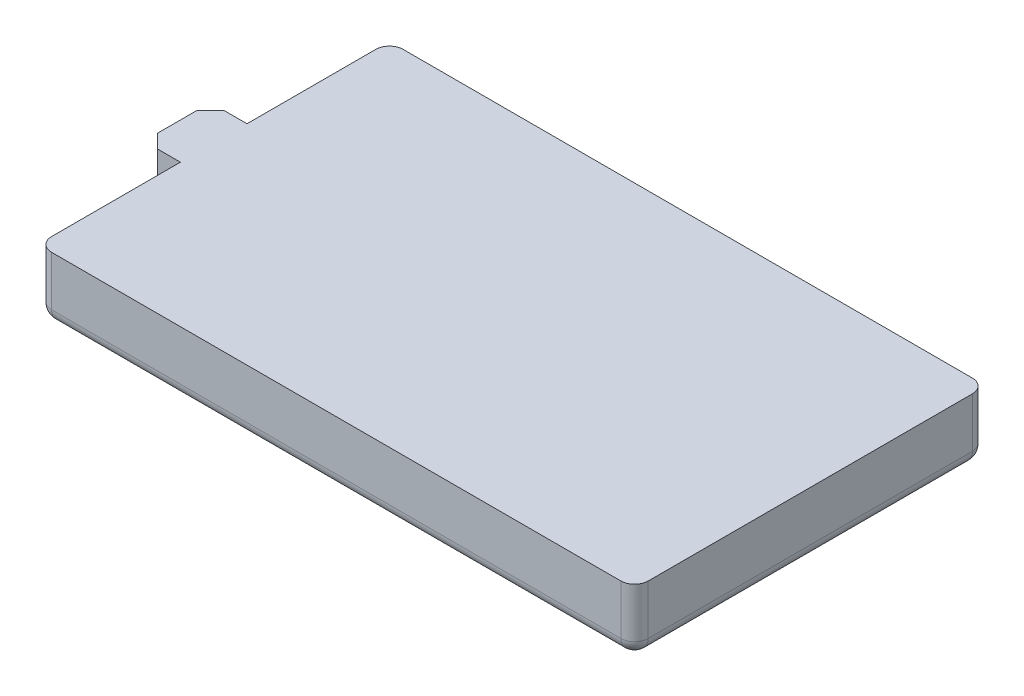
ISO-10303-21;
HEADER;
FILE_DESCRIPTION(('STEP AP214'),'2;1');
FILE_NAME('part.step','',(''),(''),'','','');
FILE_SCHEMA(('AUTOMOTIVE_DESIGN { 1 0 10303 214 1 1 1 1 }'));
ENDSEC;
DATA;
#1=APPLICATION_CONTEXT('core data for automotive mechanical design processes');
#2=APPLICATION_PROTOCOL_DEFINITION('international standard','automotive_design',2000,#1);
#3=PRODUCT_CONTEXT('',#1,'mechanical');
#4=PRODUCT('Part','Part','',(#3));
#5=PRODUCT_RELATED_PRODUCT_CATEGORY('part','',(#4));
#6=PRODUCT_DEFINITION_FORMATION('','',#4);
#7=PRODUCT_DEFINITION_CONTEXT('part definition',#1,'design');
#8=PRODUCT_DEFINITION('design','',#6,#7);
#9=PRODUCT_DEFINITION_SHAPE('','',#8);
#10=(LENGTH_UNIT() NAMED_UNIT(*) SI_UNIT(.MILLI.,.METRE.));
#11=(NAMED_UNIT(*) PLANE_ANGLE_UNIT() SI_UNIT($,.RADIAN.));
#12=(NAMED_UNIT(*) SI_UNIT($,.STERADIAN.) SOLID_ANGLE_UNIT());
#13=UNCERTAINTY_MEASURE_WITH_UNIT(LENGTH_MEASURE(1.E-05),#10,'distance_accuracy_value','');
#14=(GEOMETRIC_REPRESENTATION_CONTEXT(3) GLOBAL_UNCERTAINTY_ASSIGNED_CONTEXT((#13)) GLOBAL_UNIT_ASSIGNED_CONTEXT((#10,
#11,#12)) REPRESENTATION_CONTEXT('',''));
#15=CARTESIAN_POINT('',(0.,0.,0.));
#16=DIRECTION('',(0.,0.,1.));
#17=DIRECTION('',(1.,0.,0.));
#18=AXIS2_PLACEMENT_3D('',#15,#16,#17);
#19=CARTESIAN_POINT('',(55.3529500000001,11.7856,-32.6136));
#20=DIRECTION('',(-1.,0.,0.));
#21=DIRECTION('',(0.,0.,1.));
#22=AXIS2_PLACEMENT_3D('',#19,#20,#21);
#23=PLANE('',#22);
#24=DIRECTION('',(0.,0.,-1.));
#25=VECTOR('',#24,1.);
#26=CARTESIAN_POINT('',(55.3529500000001,2.54,-32.6136));
#27=LINE('',#26,#25);
#28=CARTESIAN_POINT('',(55.3529500000001,2.54,30.0736));
#29=VERTEX_POINT('',#28);
#30=CARTESIAN_POINT('',(55.3529500000001,2.54,-30.0736));
#31=VERTEX_POINT('',#30);
#32=EDGE_CURVE('E232',#29,#31,#27,.T.);
#33=ORIENTED_EDGE('',*,*,#32,.T.);
#34=DIRECTION('',(0.,-1.,0.));
#35=VECTOR('',#34,1.);
#36=CARTESIAN_POINT('',(55.3529500000001,11.7856,-30.0736));
#37=LINE('',#36,#35);
#38=CARTESIAN_POINT('',(55.3529500000001,11.7856,-30.0736));
#39=VERTEX_POINT('',#38);
#40=EDGE_CURVE('E234',#31,#39,#37,.F.);
#41=ORIENTED_EDGE('',*,*,#40,.T.);
#42=DIRECTION('',(0.,0.,-1.));
#43=VECTOR('',#42,1.);
#44=CARTESIAN_POINT('',(55.3529500000001,11.7856,-32.6136));
#45=LINE('',#44,#43);
#46=CARTESIAN_POINT('',(55.3529500000001,11.7856,30.0736));
#47=VERTEX_POINT('',#46);
#48=EDGE_CURVE('E197',#47,#39,#45,.T.);
#49=ORIENTED_EDGE('',*,*,#48,.F.);
#50=DIRECTION('',(0.,-1.,0.));
#51=VECTOR('',#50,1.);
#52=CARTESIAN_POINT('',(55.3529500000001,11.7856,30.0736));
#53=LINE('',#52,#51);
#54=EDGE_CURVE('E230',#47,#29,#53,.T.);
#55=ORIENTED_EDGE('',*,*,#54,.T.);
#56=EDGE_LOOP('',(#33,#41,#49,#55));
#57=FACE_BOUND('',#56,.T.);
#58=ADVANCED_FACE('F33',(#57),#23,.F.);
#59=CARTESIAN_POINT('',(-55.3529499999999,11.7856,-32.6136));
#60=DIRECTION('',(0.,0.,1.));
#61=DIRECTION('',(1.,0.,0.));
#62=AXIS2_PLACEMENT_3D('',#59,#60,#61);
#63=PLANE('',#62);
#64=DIRECTION('',(-1.,0.,0.));
#65=VECTOR('',#64,1.);
#66=CARTESIAN_POINT('',(-55.3529499999999,11.7856,-32.6136));
#67=LINE('',#66,#65);
#68=CARTESIAN_POINT('',(52.8129500000001,11.7856,-32.6136));
#69=VERTEX_POINT('',#68);
#70=CARTESIAN_POINT('',(-52.8129499999999,11.7856,-32.6136));
#71=VERTEX_POINT('',#70);
#72=EDGE_CURVE('E163',#69,#71,#67,.T.);
#73=ORIENTED_EDGE('',*,*,#72,.F.);
#74=DIRECTION('',(0.,-1.,0.));
#75=VECTOR('',#74,1.);
#76=CARTESIAN_POINT('',(52.8129500000001,11.7856,-32.6136));
#77=LINE('',#76,#75);
#78=CARTESIAN_POINT('',(52.8129500000001,2.54,-32.6136));
#79=VERTEX_POINT('',#78);
#80=EDGE_CURVE('E228',#69,#79,#77,.T.);
#81=ORIENTED_EDGE('',*,*,#80,.T.);
#82=DIRECTION('',(-1.,0.,0.));
#83=VECTOR('',#82,1.);
#84=CARTESIAN_POINT('',(-55.3529499999999,2.54,-32.6136));
#85=LINE('',#84,#83);
#86=CARTESIAN_POINT('',(-52.8129499999999,2.54,-32.6136));
#87=VERTEX_POINT('',#86);
#88=EDGE_CURVE('E226',#79,#87,#85,.T.);
#89=ORIENTED_EDGE('',*,*,#88,.T.);
#90=DIRECTION('',(0.,-1.,0.));
#91=VECTOR('',#90,1.);
#92=CARTESIAN_POINT('',(-52.8129499999999,11.7856,-32.6136));
#93=LINE('',#92,#91);
#94=EDGE_CURVE('E224',#87,#71,#93,.F.);
#95=ORIENTED_EDGE('',*,*,#94,.T.);
#96=EDGE_LOOP('',(#73,#81,#89,#95));
#97=FACE_BOUND('',#96,.T.);
#98=ADVANCED_FACE('F382',(#97),#63,.F.);
#99=CARTESIAN_POINT('',(-55.3529499999999,11.7856,-32.6136));
#100=DIRECTION('',(1.,0.,0.));
#101=DIRECTION('',(0.,0.,-1.));
#102=AXIS2_PLACEMENT_3D('',#99,#100,#101);
#103=PLANE('',#102);
#104=DIRECTION('',(0.,-1.,0.));
#105=VECTOR('',#104,1.);
#106=CARTESIAN_POINT('',(-55.3529499999999,11.7856,-30.0736));
#107=LINE('',#106,#105);
#108=CARTESIAN_POINT('',(-55.3529499999999,11.7856,-30.0736));
#109=VERTEX_POINT('',#108);
#110=CARTESIAN_POINT('',(-55.3529499999999,2.54,-30.0736));
#111=VERTEX_POINT('',#110);
#112=EDGE_CURVE('E215',#109,#111,#107,.T.);
#113=ORIENTED_EDGE('',*,*,#112,.T.);
#114=DIRECTION('',(0.,0.,1.));
#115=VECTOR('',#114,1.);
#116=CARTESIAN_POINT('',(-55.3529499999999,2.54,-32.6136));
#117=LINE('',#116,#115);
#118=CARTESIAN_POINT('',(-55.3529499999999,2.54,-6.17855));
#119=VERTEX_POINT('',#118);
#120=EDGE_CURVE('E169',#111,#119,#117,.T.);
#121=ORIENTED_EDGE('',*,*,#120,.T.);
#122=DIRECTION('',(0.,-1.,0.));
#123=VECTOR('',#122,1.);
#124=CARTESIAN_POINT('',(-55.3529499999999,11.7856,-6.17855));
#125=LINE('',#124,#123);
#126=CARTESIAN_POINT('',(-55.3529499999999,11.7856,-6.17855));
#127=VERTEX_POINT('',#126);
#128=EDGE_CURVE('E166',#127,#119,#125,.T.);
#129=ORIENTED_EDGE('',*,*,#128,.F.);
#130=DIRECTION('',(0.,0.,1.));
#131=VECTOR('',#130,1.);
#132=CARTESIAN_POINT('',(-55.3529499999999,11.7856,-32.6136));
#133=LINE('',#132,#131);
#134=EDGE_CURVE('E153',#109,#127,#133,.T.);
#135=ORIENTED_EDGE('',*,*,#134,.F.);
#136=EDGE_LOOP('',(#113,#121,#129,#135));
#137=FACE_BOUND('',#136,.T.);
#138=ADVANCED_FACE('F167',(#137),#103,.F.);
#139=CARTESIAN_POINT('',(-62.13475,11.7856,-6.17855));
#140=DIRECTION('',(0.,0.,1.));
#141=DIRECTION('',(1.,0.,0.));
#142=AXIS2_PLACEMENT_3D('',#139,#140,#141);
#143=PLANE('',#142);
#144=DIRECTION('',(-1.,0.,0.));
#145=VECTOR('',#144,1.);
#146=CARTESIAN_POINT('',(-62.13475,0.,-6.17855));
#147=LINE('',#146,#145);
#148=CARTESIAN_POINT('',(-52.8129499999999,0.,-6.17855));
#149=VERTEX_POINT('',#148);
#150=CARTESIAN_POINT('',(-59.59475,0.,-6.17855));
#151=VERTEX_POINT('',#150);
#152=EDGE_CURVE('E189',#149,#151,#147,.T.);
#153=ORIENTED_EDGE('',*,*,#152,.T.);
#154=DIRECTION('',(0.,1.,0.));
#155=VECTOR('',#154,1.);
#156=CARTESIAN_POINT('',(-59.59475,11.7856,-6.17855));
#157=LINE('',#156,#155);
#158=CARTESIAN_POINT('',(-59.59475,11.7856,-6.17855));
#159=VERTEX_POINT('',#158);
#160=EDGE_CURVE('E56',#151,#159,#157,.T.);
#161=ORIENTED_EDGE('',*,*,#160,.T.);
#162=DIRECTION('',(-1.,0.,0.));
#163=VECTOR('',#162,1.);
#164=CARTESIAN_POINT('',(-62.13475,11.7856,-6.17855));
#165=LINE('',#164,#163);
#166=EDGE_CURVE('E156',#127,#159,#165,.T.);
#167=ORIENTED_EDGE('',*,*,#166,.F.);
#168=ORIENTED_EDGE('',*,*,#128,.T.);
#169=CARTESIAN_POINT('',(-52.8129499999999,2.54,-6.17855));
#170=DIRECTION('',(0.,0.,1.));
#171=DIRECTION('',(1.,0.,0.));
#172=AXIS2_PLACEMENT_3D('',#169,#170,#171);
#173=CIRCLE('',#172,2.54);
#174=EDGE_CURVE('E245',#119,#149,#173,.T.);
#175=ORIENTED_EDGE('',*,*,#174,.T.);
#176=EDGE_LOOP('',(#153,#161,#167,#168,#175));
#177=FACE_BOUND('',#176,.T.);
#178=ADVANCED_FACE('F175',(#177),#143,.F.);
#179=CARTESIAN_POINT('',(-62.13475,11.7856,0.));
#180=DIRECTION('',(1.,0.,0.));
#181=DIRECTION('',(0.,0.,-1.));
#182=AXIS2_PLACEMENT_3D('',#179,#180,#181);
#183=PLANE('',#182);
#184=DIRECTION('',(0.,0.,1.));
#185=VECTOR('',#184,1.);
#186=CARTESIAN_POINT('',(-62.13475,11.7856,0.));
#187=LINE('',#186,#185);
#188=CARTESIAN_POINT('',(-62.13475,11.7856,-3.63854999999999));
#189=VERTEX_POINT('',#188);
#190=CARTESIAN_POINT('',(-62.13475,11.7856,3.63854999999999));
#191=VERTEX_POINT('',#190);
#192=EDGE_CURVE('E176',#189,#191,#187,.T.);
#193=ORIENTED_EDGE('',*,*,#192,.F.);
#194=DIRECTION('',(0.,-1.,0.));
#195=VECTOR('',#194,1.);
#196=CARTESIAN_POINT('',(-62.13475,11.7856,-3.63855));
#197=LINE('',#196,#195);
#198=CARTESIAN_POINT('',(-62.13475,0.,-3.63855));
#199=VERTEX_POINT('',#198);
#200=EDGE_CURVE('E283',#189,#199,#197,.T.);
#201=ORIENTED_EDGE('',*,*,#200,.T.);
#202=DIRECTION('',(0.,0.,1.));
#203=VECTOR('',#202,1.);
#204=CARTESIAN_POINT('',(-62.13475,0.,0.));
#205=LINE('',#204,#203);
#206=CARTESIAN_POINT('',(-62.13475,0.,3.63855));
#207=VERTEX_POINT('',#206);
#208=EDGE_CURVE('E191',#199,#207,#205,.T.);
#209=ORIENTED_EDGE('',*,*,#208,.T.);
#210=DIRECTION('',(0.,1.,0.));
#211=VECTOR('',#210,1.);
#212=CARTESIAN_POINT('',(-62.13475,11.7856,3.63855));
#213=LINE('',#212,#211);
#214=EDGE_CURVE('E247',#207,#191,#213,.T.);
#215=ORIENTED_EDGE('',*,*,#214,.T.);
#216=EDGE_LOOP('',(#193,#201,#209,#215));
#217=FACE_BOUND('',#216,.T.);
#218=ADVANCED_FACE('F295',(#217),#183,.F.);
#219=CARTESIAN_POINT('',(-62.13475,11.7856,6.17855));
#220=DIRECTION('',(0.,0.,-1.));
#221=DIRECTION('',(-1.,0.,0.));
#222=AXIS2_PLACEMENT_3D('',#219,#220,#221);
#223=PLANE('',#222);
#224=DIRECTION('',(1.,0.,0.));
#225=VECTOR('',#224,1.);
#226=CARTESIAN_POINT('',(-62.13475,11.7856,6.17855));
#227=LINE('',#226,#225);
#228=CARTESIAN_POINT('',(-59.59475,11.7856,6.17855));
#229=VERTEX_POINT('',#228);
#230=CARTESIAN_POINT('',(-55.3529499999999,11.7856,6.17855));
#231=VERTEX_POINT('',#230);
#232=EDGE_CURVE('E178',#229,#231,#227,.T.);
#233=ORIENTED_EDGE('',*,*,#232,.F.);
#234=DIRECTION('',(0.,-1.,0.));
#235=VECTOR('',#234,1.);
#236=CARTESIAN_POINT('',(-59.59475,11.7856,6.17855));
#237=LINE('',#236,#235);
#238=CARTESIAN_POINT('',(-59.59475,0.,6.17855));
#239=VERTEX_POINT('',#238);
#240=EDGE_CURVE('E11',#229,#239,#237,.T.);
#241=ORIENTED_EDGE('',*,*,#240,.T.);
#242=DIRECTION('',(1.,0.,0.));
#243=VECTOR('',#242,1.);
#244=CARTESIAN_POINT('',(-62.13475,0.,6.17855));
#245=LINE('',#244,#243);
#246=CARTESIAN_POINT('',(-52.8129499999999,0.,6.17855));
#247=VERTEX_POINT('',#246);
#248=EDGE_CURVE('E195',#239,#247,#245,.T.);
#249=ORIENTED_EDGE('',*,*,#248,.T.);
#250=CARTESIAN_POINT('',(-52.8129499999999,2.54,6.17855));
#251=DIRECTION('',(0.,0.,-1.));
#252=DIRECTION('',(-1.,0.,0.));
#253=AXIS2_PLACEMENT_3D('',#250,#251,#252);
#254=CIRCLE('',#253,2.54);
#255=CARTESIAN_POINT('',(-55.3529499999999,2.54,6.17855));
#256=VERTEX_POINT('',#255);
#257=EDGE_CURVE('E243',#247,#256,#254,.T.);
#258=ORIENTED_EDGE('',*,*,#257,.T.);
#259=DIRECTION('',(0.,-1.,0.));
#260=VECTOR('',#259,1.);
#261=CARTESIAN_POINT('',(-55.3529499999999,11.7856,6.17855));
#262=LINE('',#261,#260);
#263=EDGE_CURVE('E173',#231,#256,#262,.T.);
#264=ORIENTED_EDGE('',*,*,#263,.F.);
#265=EDGE_LOOP('',(#233,#241,#249,#258,#264));
#266=FACE_BOUND('',#265,.T.);
#267=ADVANCED_FACE('F338',(#266),#223,.F.);
#268=CARTESIAN_POINT('',(-55.3529499999999,11.7856,6.17855));
#269=DIRECTION('',(1.,0.,0.));
#270=DIRECTION('',(0.,0.,-1.));
#271=AXIS2_PLACEMENT_3D('',#268,#269,#270);
#272=PLANE('',#271);
#273=ORIENTED_EDGE('',*,*,#263,.T.);
#274=DIRECTION('',(0.,0.,1.));
#275=VECTOR('',#274,1.);
#276=CARTESIAN_POINT('',(-55.3529499999999,2.54,6.17855));
#277=LINE('',#276,#275);
#278=CARTESIAN_POINT('',(-55.3529499999999,2.54,30.0736));
#279=VERTEX_POINT('',#278);
#280=EDGE_CURVE('E201',#256,#279,#277,.T.);
#281=ORIENTED_EDGE('',*,*,#280,.T.);
#282=DIRECTION('',(0.,-1.,0.));
#283=VECTOR('',#282,1.);
#284=CARTESIAN_POINT('',(-55.3529499999999,11.7856,30.0736));
#285=LINE('',#284,#283);
#286=CARTESIAN_POINT('',(-55.3529499999999,11.7856,30.0736));
#287=VERTEX_POINT('',#286);
#288=EDGE_CURVE('E172',#279,#287,#285,.F.);
#289=ORIENTED_EDGE('',*,*,#288,.T.);
#290=DIRECTION('',(0.,0.,1.));
#291=VECTOR('',#290,1.);
#292=CARTESIAN_POINT('',(-55.3529499999999,11.7856,6.17855));
#293=LINE('',#292,#291);
#294=EDGE_CURVE('E183',#231,#287,#293,.T.);
#295=ORIENTED_EDGE('',*,*,#294,.F.);
#296=EDGE_LOOP('',(#273,#281,#289,#295));
#297=FACE_BOUND('',#296,.T.);
#298=ADVANCED_FACE('F341',(#297),#272,.F.);
#299=CARTESIAN_POINT('',(-55.3529499999999,11.7856,32.6136));
#300=DIRECTION('',(0.,0.,-1.));
#301=DIRECTION('',(-1.,0.,0.));
#302=AXIS2_PLACEMENT_3D('',#299,#300,#301);
#303=PLANE('',#302);
#304=DIRECTION('',(1.,0.,0.));
#305=VECTOR('',#304,1.);
#306=CARTESIAN_POINT('',(-55.3529499999999,11.7856,32.6136));
#307=LINE('',#306,#305);
#308=CARTESIAN_POINT('',(-52.8129499999999,11.7856,32.6136));
#309=VERTEX_POINT('',#308);
#310=CARTESIAN_POINT('',(52.81295,11.7856,32.6136));
#311=VERTEX_POINT('',#310);
#312=EDGE_CURVE('E186',#309,#311,#307,.T.);
#313=ORIENTED_EDGE('',*,*,#312,.F.);
#314=DIRECTION('',(0.,-1.,0.));
#315=VECTOR('',#314,1.);
#316=CARTESIAN_POINT('',(-52.8129499999999,11.7856,32.6136));
#317=LINE('',#316,#315);
#318=CARTESIAN_POINT('',(-52.8129499999999,2.54,32.6136));
#319=VERTEX_POINT('',#318);
#320=EDGE_CURVE('E222',#309,#319,#317,.T.);
#321=ORIENTED_EDGE('',*,*,#320,.T.);
#322=DIRECTION('',(1.,0.,0.));
#323=VECTOR('',#322,1.);
#324=CARTESIAN_POINT('',(-55.3529499999999,2.54,32.6136));
#325=LINE('',#324,#323);
#326=CARTESIAN_POINT('',(52.8129500000001,2.54,32.6136));
#327=VERTEX_POINT('',#326);
#328=EDGE_CURVE('E220',#319,#327,#325,.T.);
#329=ORIENTED_EDGE('',*,*,#328,.T.);
#330=DIRECTION('',(0.,-1.,0.));
#331=VECTOR('',#330,1.);
#332=CARTESIAN_POINT('',(52.8129500000001,11.7856,32.6136));
#333=LINE('',#332,#331);
#334=EDGE_CURVE('E218',#327,#311,#333,.F.);
#335=ORIENTED_EDGE('',*,*,#334,.T.);
#336=EDGE_LOOP('',(#313,#321,#329,#335));
#337=FACE_BOUND('',#336,.T.);
#338=ADVANCED_FACE('F350',(#337),#303,.F.);
#339=CARTESIAN_POINT('',(0.,11.7856,0.));
#340=DIRECTION('',(0.,1.,0.));
#341=DIRECTION('',(0.,0.,1.));
#342=AXIS2_PLACEMENT_3D('',#339,#340,#341);
#343=PLANE('',#342);
#344=ORIENTED_EDGE('',*,*,#166,.T.);
#345=DIRECTION('',(0.707106781186547,0.,-0.707106781186548));
#346=VECTOR('',#345,1.);
#347=CARTESIAN_POINT('',(-32.88665,11.7856,-32.88665));
#348=LINE('',#347,#346);
#349=EDGE_CURVE('E41',#159,#189,#348,.F.);
#350=ORIENTED_EDGE('',*,*,#349,.T.);
#351=ORIENTED_EDGE('',*,*,#192,.T.);
#352=DIRECTION('',(-0.707106781186547,0.,-0.707106781186548));
#353=VECTOR('',#352,1.);
#354=CARTESIAN_POINT('',(-32.88665,11.7856,32.88665));
#355=LINE('',#354,#353);
#356=EDGE_CURVE('E48',#191,#229,#355,.F.);
#357=ORIENTED_EDGE('',*,*,#356,.T.);
#358=ORIENTED_EDGE('',*,*,#232,.T.);
#359=ORIENTED_EDGE('',*,*,#294,.T.);
#360=CARTESIAN_POINT('',(-52.8129499999999,11.7856,30.0736));
#361=DIRECTION('',(0.,1.,0.));
#362=DIRECTION('',(0.,0.,1.));
#363=AXIS2_PLACEMENT_3D('',#360,#361,#362);
#364=CIRCLE('',#363,2.54);
#365=EDGE_CURVE('E238',#287,#309,#364,.T.);
#366=ORIENTED_EDGE('',*,*,#365,.T.);
#367=ORIENTED_EDGE('',*,*,#312,.T.);
#368=CARTESIAN_POINT('',(52.8129500000001,11.7856,30.0736));
#369=DIRECTION('',(0.,1.,0.));
#370=DIRECTION('',(0.,0.,1.));
#371=AXIS2_PLACEMENT_3D('',#368,#369,#370);
#372=CIRCLE('',#371,2.54);
#373=EDGE_CURVE('E236',#311,#47,#372,.T.);
#374=ORIENTED_EDGE('',*,*,#373,.T.);
#375=ORIENTED_EDGE('',*,*,#48,.T.);
#376=CARTESIAN_POINT('',(52.8129500000001,11.7856,-30.0736));
#377=DIRECTION('',(0.,1.,0.));
#378=DIRECTION('',(0.,0.,1.));
#379=AXIS2_PLACEMENT_3D('',#376,#377,#378);
#380=CIRCLE('',#379,2.54);
#381=EDGE_CURVE('E241',#39,#69,#380,.T.);
#382=ORIENTED_EDGE('',*,*,#381,.T.);
#383=ORIENTED_EDGE('',*,*,#72,.T.);
#384=CARTESIAN_POINT('',(-52.8129499999999,11.7856,-30.0736));
#385=DIRECTION('',(0.,1.,0.));
#386=DIRECTION('',(0.,0.,1.));
#387=AXIS2_PLACEMENT_3D('',#384,#385,#386);
#388=CIRCLE('',#387,2.54);
#389=EDGE_CURVE('E160',#71,#109,#388,.T.);
#390=ORIENTED_EDGE('',*,*,#389,.T.);
#391=ORIENTED_EDGE('',*,*,#134,.T.);
#392=EDGE_LOOP('',(#344,#350,#351,#357,#358,#359,#366,#367,#374,#375,#382,#383,#390,#391));
#393=FACE_BOUND('',#392,.T.);
#394=ADVANCED_FACE('F155',(#393),#343,.T.);
#395=CARTESIAN_POINT('',(0.,0.,0.));
#396=DIRECTION('',(0.,1.,0.));
#397=DIRECTION('',(0.,0.,1.));
#398=AXIS2_PLACEMENT_3D('',#395,#396,#397);
#399=PLANE('',#398);
#400=ORIENTED_EDGE('',*,*,#208,.F.);
#401=DIRECTION('',(-0.707106781186547,0.,0.707106781186548));
#402=VECTOR('',#401,1.);
#403=CARTESIAN_POINT('',(-62.13475,0.,-3.63855));
#404=LINE('',#403,#402);
#405=EDGE_CURVE('E288',#199,#151,#404,.F.);
#406=ORIENTED_EDGE('',*,*,#405,.T.);
#407=ORIENTED_EDGE('',*,*,#152,.F.);
#408=DIRECTION('',(0.,0.,1.));
#409=VECTOR('',#408,1.);
#410=CARTESIAN_POINT('',(-52.8129499999999,0.,0.));
#411=LINE('',#410,#409);
#412=CARTESIAN_POINT('',(-52.8129499999999,0.,-30.0736));
#413=VERTEX_POINT('',#412);
#414=EDGE_CURVE('E210',#149,#413,#411,.F.);
#415=ORIENTED_EDGE('',*,*,#414,.T.);
#416=DIRECTION('',(-1.,0.,0.));
#417=VECTOR('',#416,1.);
#418=CARTESIAN_POINT('',(0.,0.,-30.0736));
#419=LINE('',#418,#417);
#420=CARTESIAN_POINT('',(52.8129500000001,0.,-30.0736));
#421=VERTEX_POINT('',#420);
#422=EDGE_CURVE('E206',#413,#421,#419,.F.);
#423=ORIENTED_EDGE('',*,*,#422,.T.);
#424=DIRECTION('',(0.,0.,-1.));
#425=VECTOR('',#424,1.);
#426=CARTESIAN_POINT('',(52.8129500000001,0.,0.));
#427=LINE('',#426,#425);
#428=CARTESIAN_POINT('',(52.8129500000001,0.,30.0736));
#429=VERTEX_POINT('',#428);
#430=EDGE_CURVE('E204',#421,#429,#427,.F.);
#431=ORIENTED_EDGE('',*,*,#430,.T.);
#432=DIRECTION('',(1.,0.,0.));
#433=VECTOR('',#432,1.);
#434=CARTESIAN_POINT('',(0.,0.,30.0736));
#435=LINE('',#434,#433);
#436=CARTESIAN_POINT('',(-52.8129499999999,0.,30.0736));
#437=VERTEX_POINT('',#436);
#438=EDGE_CURVE('E208',#429,#437,#435,.F.);
#439=ORIENTED_EDGE('',*,*,#438,.T.);
#440=DIRECTION('',(0.,0.,1.));
#441=VECTOR('',#440,1.);
#442=CARTESIAN_POINT('',(-52.8129499999999,0.,0.));
#443=LINE('',#442,#441);
#444=EDGE_CURVE('E212',#437,#247,#443,.F.);
#445=ORIENTED_EDGE('',*,*,#444,.T.);
#446=ORIENTED_EDGE('',*,*,#248,.F.);
#447=DIRECTION('',(0.707106781186547,0.,0.707106781186548));
#448=VECTOR('',#447,1.);
#449=CARTESIAN_POINT('',(-59.59475,0.,6.17855));
#450=LINE('',#449,#448);
#451=EDGE_CURVE('E286',#239,#207,#450,.F.);
#452=ORIENTED_EDGE('',*,*,#451,.T.);
#453=EDGE_LOOP('',(#400,#406,#407,#415,#423,#431,#439,#445,#446,#452));
#454=FACE_BOUND('',#453,.T.);
#455=ADVANCED_FACE('F300',(#454),#399,.F.);
#456=CARTESIAN_POINT('',(-52.8129499999999,11.7856,-30.0736));
#457=DIRECTION('',(0.,-1.,0.));
#458=DIRECTION('',(0.,0.,-1.));
#459=AXIS2_PLACEMENT_3D('',#456,#457,#458);
#460=CYLINDRICAL_SURFACE('',#459,2.54);
#461=ORIENTED_EDGE('',*,*,#389,.F.);
#462=ORIENTED_EDGE('',*,*,#94,.F.);
#463=CARTESIAN_POINT('',(-52.8129499999999,2.54,-30.0736));
#464=DIRECTION('',(0.,-1.,0.));
#465=DIRECTION('',(0.,0.,-1.));
#466=AXIS2_PLACEMENT_3D('',#463,#464,#465);
#467=CIRCLE('',#466,2.54);
#468=EDGE_CURVE('E192',#111,#87,#467,.T.);
#469=ORIENTED_EDGE('',*,*,#468,.F.);
#470=ORIENTED_EDGE('',*,*,#112,.F.);
#471=EDGE_LOOP('',(#461,#462,#469,#470));
#472=FACE_BOUND('',#471,.T.);
#473=ADVANCED_FACE('F367',(#472),#460,.T.);
#474=CARTESIAN_POINT('',(-52.8129499999999,2.54,-32.6136));
#475=DIRECTION('',(0.,0.,1.));
#476=DIRECTION('',(1.,0.,0.));
#477=AXIS2_PLACEMENT_3D('',#474,#475,#476);
#478=CYLINDRICAL_SURFACE('',#477,2.54);
#479=ORIENTED_EDGE('',*,*,#174,.F.);
#480=ORIENTED_EDGE('',*,*,#120,.F.);
#481=CARTESIAN_POINT('',(-52.8129499999999,2.54,-30.0736));
#482=DIRECTION('',(0.,0.,-1.));
#483=DIRECTION('',(-1.,0.,0.));
#484=AXIS2_PLACEMENT_3D('',#481,#482,#483);
#485=CIRCLE('',#484,2.54);
#486=EDGE_CURVE('E277',#413,#111,#485,.T.);
#487=ORIENTED_EDGE('',*,*,#486,.F.);
#488=ORIENTED_EDGE('',*,*,#414,.F.);
#489=EDGE_LOOP('',(#479,#480,#487,#488));
#490=FACE_BOUND('',#489,.T.);
#491=ADVANCED_FACE('F304',(#490),#478,.T.);
#492=CARTESIAN_POINT('',(-52.8129499999999,2.54,-30.0736));
#493=DIRECTION('',(0.,0.,1.));
#494=DIRECTION('',(1.,0.,0.));
#495=AXIS2_PLACEMENT_3D('',#492,#493,#494);
#496=SPHERICAL_SURFACE('',#495,2.54);
#497=ORIENTED_EDGE('',*,*,#486,.T.);
#498=ORIENTED_EDGE('',*,*,#468,.T.);
#499=CARTESIAN_POINT('',(-52.8129499999999,2.54,-30.0736));
#500=DIRECTION('',(-1.,0.,0.));
#501=DIRECTION('',(0.,0.,1.));
#502=AXIS2_PLACEMENT_3D('',#499,#500,#501);
#503=CIRCLE('',#502,2.54);
#504=EDGE_CURVE('E274',#413,#87,#503,.F.);
#505=ORIENTED_EDGE('',*,*,#504,.F.);
#506=EDGE_LOOP('',(#497,#498,#505));
#507=FACE_BOUND('',#506,.T.);
#508=ADVANCED_FACE('F370',(#507),#496,.T.);
#509=CARTESIAN_POINT('',(52.8129500000001,11.7856,-30.0736));
#510=DIRECTION('',(0.,-1.,0.));
#511=DIRECTION('',(0.,0.,-1.));
#512=AXIS2_PLACEMENT_3D('',#509,#510,#511);
#513=CYLINDRICAL_SURFACE('',#512,2.54);
#514=ORIENTED_EDGE('',*,*,#381,.F.);
#515=ORIENTED_EDGE('',*,*,#40,.F.);
#516=CARTESIAN_POINT('',(52.8129500000001,2.54,-30.0736));
#517=DIRECTION('',(0.,-1.,0.));
#518=DIRECTION('',(0.,0.,-1.));
#519=AXIS2_PLACEMENT_3D('',#516,#517,#518);
#520=CIRCLE('',#519,2.54);
#521=EDGE_CURVE('E271',#79,#31,#520,.T.);
#522=ORIENTED_EDGE('',*,*,#521,.F.);
#523=ORIENTED_EDGE('',*,*,#80,.F.);
#524=EDGE_LOOP('',(#514,#515,#522,#523));
#525=FACE_BOUND('',#524,.T.);
#526=ADVANCED_FACE('F372',(#525),#513,.T.);
#527=CARTESIAN_POINT('',(-55.3529499999999,2.54,-30.0736));
#528=DIRECTION('',(-1.,0.,0.));
#529=DIRECTION('',(0.,0.,1.));
#530=AXIS2_PLACEMENT_3D('',#527,#528,#529);
#531=CYLINDRICAL_SURFACE('',#530,2.54);
#532=ORIENTED_EDGE('',*,*,#504,.T.);
#533=ORIENTED_EDGE('',*,*,#88,.F.);
#534=CARTESIAN_POINT('',(52.8129500000001,2.54,-30.0736));
#535=DIRECTION('',(1.,0.,0.));
#536=DIRECTION('',(0.,0.,-1.));
#537=AXIS2_PLACEMENT_3D('',#534,#535,#536);
#538=CIRCLE('',#537,2.54);
#539=EDGE_CURVE('E268',#421,#79,#538,.T.);
#540=ORIENTED_EDGE('',*,*,#539,.F.);
#541=ORIENTED_EDGE('',*,*,#422,.F.);
#542=EDGE_LOOP('',(#532,#533,#540,#541));
#543=FACE_BOUND('',#542,.T.);
#544=ADVANCED_FACE('F313',(#543),#531,.T.);
#545=CARTESIAN_POINT('',(52.8129500000001,2.54,-30.0736));
#546=DIRECTION('',(0.,0.,1.));
#547=DIRECTION('',(1.,0.,0.));
#548=AXIS2_PLACEMENT_3D('',#545,#546,#547);
#549=SPHERICAL_SURFACE('',#548,2.54);
#550=ORIENTED_EDGE('',*,*,#539,.T.);
#551=ORIENTED_EDGE('',*,*,#521,.T.);
#552=CARTESIAN_POINT('',(52.8129500000001,2.54,-30.0736));
#553=DIRECTION('',(0.,0.,-1.));
#554=DIRECTION('',(-1.,0.,0.));
#555=AXIS2_PLACEMENT_3D('',#552,#553,#554);
#556=CIRCLE('',#555,2.54);
#557=EDGE_CURVE('E265',#421,#31,#556,.F.);
#558=ORIENTED_EDGE('',*,*,#557,.F.);
#559=EDGE_LOOP('',(#550,#551,#558));
#560=FACE_BOUND('',#559,.T.);
#561=ADVANCED_FACE('F316',(#560),#549,.T.);
#562=CARTESIAN_POINT('',(52.8129500000001,11.7856,30.0736));
#563=DIRECTION('',(0.,-1.,0.));
#564=DIRECTION('',(0.,0.,-1.));
#565=AXIS2_PLACEMENT_3D('',#562,#563,#564);
#566=CYLINDRICAL_SURFACE('',#565,2.54);
#567=ORIENTED_EDGE('',*,*,#373,.F.);
#568=ORIENTED_EDGE('',*,*,#334,.F.);
#569=CARTESIAN_POINT('',(52.8129500000001,2.54,30.0736));
#570=DIRECTION('',(0.,-1.,0.));
#571=DIRECTION('',(0.,0.,-1.));
#572=AXIS2_PLACEMENT_3D('',#569,#570,#571);
#573=CIRCLE('',#572,2.54);
#574=EDGE_CURVE('E262',#29,#327,#573,.T.);
#575=ORIENTED_EDGE('',*,*,#574,.F.);
#576=ORIENTED_EDGE('',*,*,#54,.F.);
#577=EDGE_LOOP('',(#567,#568,#575,#576));
#578=FACE_BOUND('',#577,.T.);
#579=ADVANCED_FACE('F357',(#578),#566,.T.);
#580=CARTESIAN_POINT('',(52.8129500000001,2.54,-32.6136));
#581=DIRECTION('',(0.,0.,-1.));
#582=DIRECTION('',(-1.,0.,0.));
#583=AXIS2_PLACEMENT_3D('',#580,#581,#582);
#584=CYLINDRICAL_SURFACE('',#583,2.54);
#585=ORIENTED_EDGE('',*,*,#557,.T.);
#586=ORIENTED_EDGE('',*,*,#32,.F.);
#587=CARTESIAN_POINT('',(52.8129500000001,2.54,30.0736));
#588=DIRECTION('',(0.,0.,1.));
#589=DIRECTION('',(1.,0.,0.));
#590=AXIS2_PLACEMENT_3D('',#587,#588,#589);
#591=CIRCLE('',#590,2.54);
#592=EDGE_CURVE('E259',#429,#29,#591,.T.);
#593=ORIENTED_EDGE('',*,*,#592,.F.);
#594=ORIENTED_EDGE('',*,*,#430,.F.);
#595=EDGE_LOOP('',(#585,#586,#593,#594));
#596=FACE_BOUND('',#595,.T.);
#597=ADVANCED_FACE('F319',(#596),#584,.T.);
#598=CARTESIAN_POINT('',(52.8129500000001,2.54,30.0736));
#599=DIRECTION('',(0.,0.,1.));
#600=DIRECTION('',(1.,0.,0.));
#601=AXIS2_PLACEMENT_3D('',#598,#599,#600);
#602=SPHERICAL_SURFACE('',#601,2.54);
#603=ORIENTED_EDGE('',*,*,#592,.T.);
#604=ORIENTED_EDGE('',*,*,#574,.T.);
#605=CARTESIAN_POINT('',(52.8129500000001,2.54,30.0736));
#606=DIRECTION('',(1.,0.,0.));
#607=DIRECTION('',(0.,0.,-1.));
#608=AXIS2_PLACEMENT_3D('',#605,#606,#607);
#609=CIRCLE('',#608,2.54);
#610=EDGE_CURVE('E256',#429,#327,#609,.F.);
#611=ORIENTED_EDGE('',*,*,#610,.F.);
#612=EDGE_LOOP('',(#603,#604,#611));
#613=FACE_BOUND('',#612,.T.);
#614=ADVANCED_FACE('F324',(#613),#602,.T.);
#615=CARTESIAN_POINT('',(-52.8129499999999,11.7856,30.0736));
#616=DIRECTION('',(0.,-1.,0.));
#617=DIRECTION('',(0.,0.,-1.));
#618=AXIS2_PLACEMENT_3D('',#615,#616,#617);
#619=CYLINDRICAL_SURFACE('',#618,2.54);
#620=ORIENTED_EDGE('',*,*,#365,.F.);
#621=ORIENTED_EDGE('',*,*,#288,.F.);
#622=CARTESIAN_POINT('',(-52.8129499999999,2.54,30.0736));
#623=DIRECTION('',(0.,-1.,0.));
#624=DIRECTION('',(0.,0.,-1.));
#625=AXIS2_PLACEMENT_3D('',#622,#623,#624);
#626=CIRCLE('',#625,2.54);
#627=EDGE_CURVE('E253',#319,#279,#626,.T.);
#628=ORIENTED_EDGE('',*,*,#627,.F.);
#629=ORIENTED_EDGE('',*,*,#320,.F.);
#630=EDGE_LOOP('',(#620,#621,#628,#629));
#631=FACE_BOUND('',#630,.T.);
#632=ADVANCED_FACE('F347',(#631),#619,.T.);
#633=CARTESIAN_POINT('',(-55.3529499999999,2.54,30.0736));
#634=DIRECTION('',(1.,0.,0.));
#635=DIRECTION('',(0.,0.,-1.));
#636=AXIS2_PLACEMENT_3D('',#633,#634,#635);
#637=CYLINDRICAL_SURFACE('',#636,2.54);
#638=ORIENTED_EDGE('',*,*,#610,.T.);
#639=ORIENTED_EDGE('',*,*,#328,.F.);
#640=CARTESIAN_POINT('',(-52.8129499999999,2.54,30.0736));
#641=DIRECTION('',(-1.,0.,0.));
#642=DIRECTION('',(0.,0.,1.));
#643=AXIS2_PLACEMENT_3D('',#640,#641,#642);
#644=CIRCLE('',#643,2.54);
#645=EDGE_CURVE('E250',#437,#319,#644,.T.);
#646=ORIENTED_EDGE('',*,*,#645,.F.);
#647=ORIENTED_EDGE('',*,*,#438,.F.);
#648=EDGE_LOOP('',(#638,#639,#646,#647));
#649=FACE_BOUND('',#648,.T.);
#650=ADVANCED_FACE('F328',(#649),#637,.T.);
#651=CARTESIAN_POINT('',(-52.8129499999999,2.54,30.0736));
#652=DIRECTION('',(0.,0.,1.));
#653=DIRECTION('',(1.,0.,0.));
#654=AXIS2_PLACEMENT_3D('',#651,#652,#653);
#655=SPHERICAL_SURFACE('',#654,2.54);
#656=ORIENTED_EDGE('',*,*,#645,.T.);
#657=ORIENTED_EDGE('',*,*,#627,.T.);
#658=CARTESIAN_POINT('',(-52.8129499999999,2.54,30.0736));
#659=DIRECTION('',(0.,0.,1.));
#660=DIRECTION('',(1.,0.,0.));
#661=AXIS2_PLACEMENT_3D('',#658,#659,#660);
#662=CIRCLE('',#661,2.54);
#663=EDGE_CURVE('E248',#437,#279,#662,.F.);
#664=ORIENTED_EDGE('',*,*,#663,.F.);
#665=EDGE_LOOP('',(#656,#657,#664));
#666=FACE_BOUND('',#665,.T.);
#667=ADVANCED_FACE('F392',(#666),#655,.T.);
#668=CARTESIAN_POINT('',(-52.8129499999999,2.54,6.17855));
#669=DIRECTION('',(0.,0.,1.));
#670=DIRECTION('',(1.,0.,0.));
#671=AXIS2_PLACEMENT_3D('',#668,#669,#670);
#672=CYLINDRICAL_SURFACE('',#671,2.54);
#673=ORIENTED_EDGE('',*,*,#257,.F.);
#674=ORIENTED_EDGE('',*,*,#444,.F.);
#675=ORIENTED_EDGE('',*,*,#663,.T.);
#676=ORIENTED_EDGE('',*,*,#280,.F.);
#677=EDGE_LOOP('',(#673,#674,#675,#676));
#678=FACE_BOUND('',#677,.T.);
#679=ADVANCED_FACE('F335',(#678),#672,.T.);
#680=CARTESIAN_POINT('',(-62.13475,11.7856,-3.63855));
#681=DIRECTION('',(0.707106781186548,0.,0.707106781186547));
#682=DIRECTION('',(0.,-1.,0.));
#683=AXIS2_PLACEMENT_3D('',#680,#681,#682);
#684=PLANE('',#683);
#685=ORIENTED_EDGE('',*,*,#349,.F.);
#686=ORIENTED_EDGE('',*,*,#160,.F.);
#687=ORIENTED_EDGE('',*,*,#405,.F.);
#688=ORIENTED_EDGE('',*,*,#200,.F.);
#689=EDGE_LOOP('',(#685,#686,#687,#688));
#690=FACE_BOUND('',#689,.T.);
#691=ADVANCED_FACE('F298',(#690),#684,.F.);
#692=CARTESIAN_POINT('',(-59.59475,11.7856,6.17855));
#693=DIRECTION('',(0.707106781186548,0.,-0.707106781186547));
#694=DIRECTION('',(0.,-1.,0.));
#695=AXIS2_PLACEMENT_3D('',#692,#693,#694);
#696=PLANE('',#695);
#697=ORIENTED_EDGE('',*,*,#356,.F.);
#698=ORIENTED_EDGE('',*,*,#214,.F.);
#699=ORIENTED_EDGE('',*,*,#451,.F.);
#700=ORIENTED_EDGE('',*,*,#240,.F.);
#701=EDGE_LOOP('',(#697,#698,#699,#700));
#702=FACE_BOUND('',#701,.T.);
#703=ADVANCED_FACE('F35',(#702),#696,.F.);
#704=CLOSED_SHELL('',(#58,#98,#138,#178,#218,#267,#298,#338,#394,#455,#473,#491,#508,#526,#544,
#561,#579,#597,#614,#632,#650,#667,#679,#691,#703));
#705=MANIFOLD_SOLID_BREP('B2',#704);
#706=ADVANCED_BREP_SHAPE_REPRESENTATION('',(#18,#705),#14);
#707=SHAPE_DEFINITION_REPRESENTATION(#9,#706);
ENDSEC;
END-ISO-10303-21;
